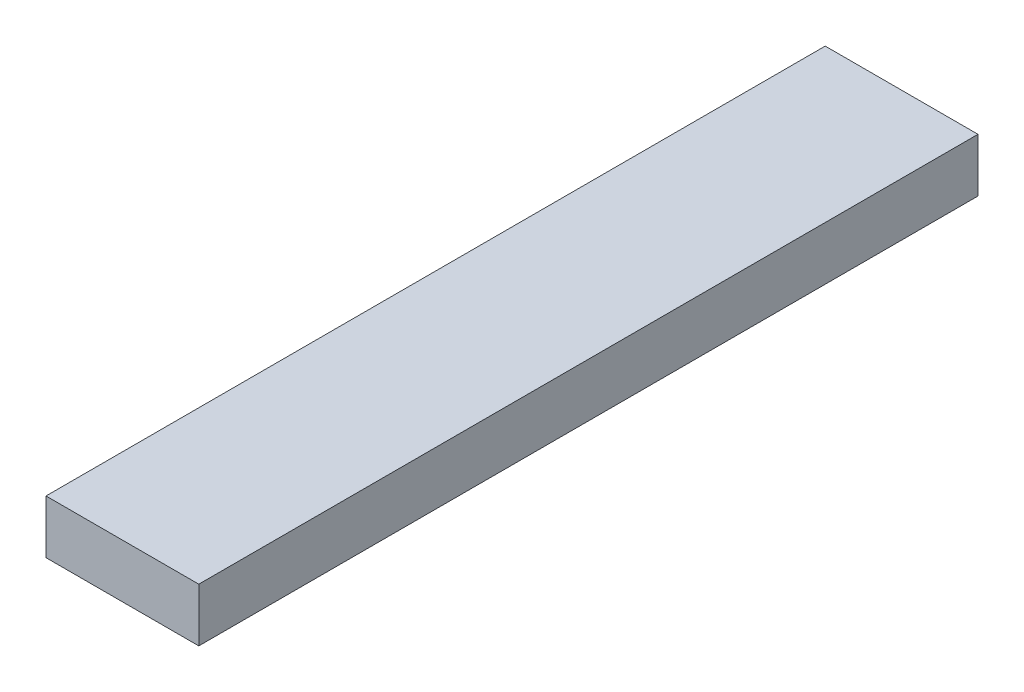
ISO-10303-21;
HEADER;
FILE_DESCRIPTION(('STEP AP214'),'2;1');
FILE_NAME('part.step','',(''),(''),'','','');
FILE_SCHEMA(('AUTOMOTIVE_DESIGN { 1 0 10303 214 1 1 1 1 }'));
ENDSEC;
DATA;
#1=APPLICATION_CONTEXT('core data for automotive mechanical design processes');
#2=APPLICATION_PROTOCOL_DEFINITION('international standard','automotive_design',2000,#1);
#3=PRODUCT_CONTEXT('',#1,'mechanical');
#4=PRODUCT('Part','Part','',(#3));
#5=PRODUCT_RELATED_PRODUCT_CATEGORY('part','',(#4));
#6=PRODUCT_DEFINITION_FORMATION('','',#4);
#7=PRODUCT_DEFINITION_CONTEXT('part definition',#1,'design');
#8=PRODUCT_DEFINITION('design','',#6,#7);
#9=PRODUCT_DEFINITION_SHAPE('','',#8);
#10=(LENGTH_UNIT() NAMED_UNIT(*) SI_UNIT(.MILLI.,.METRE.));
#11=(NAMED_UNIT(*) PLANE_ANGLE_UNIT() SI_UNIT($,.RADIAN.));
#12=(NAMED_UNIT(*) SI_UNIT($,.STERADIAN.) SOLID_ANGLE_UNIT());
#13=UNCERTAINTY_MEASURE_WITH_UNIT(LENGTH_MEASURE(1.E-05),#10,'distance_accuracy_value','');
#14=(GEOMETRIC_REPRESENTATION_CONTEXT(3) GLOBAL_UNCERTAINTY_ASSIGNED_CONTEXT((#13)) GLOBAL_UNIT_ASSIGNED_CONTEXT((#10,
#11,#12)) REPRESENTATION_CONTEXT('',''));
#15=CARTESIAN_POINT('',(0.,0.,0.));
#16=DIRECTION('',(0.,0.,1.));
#17=DIRECTION('',(1.,0.,0.));
#18=AXIS2_PLACEMENT_3D('',#15,#16,#17);
#19=CARTESIAN_POINT('',(0.,0.,-510.));
#20=DIRECTION('',(-1.,0.,0.));
#21=DIRECTION('',(0.,0.,1.));
#22=AXIS2_PLACEMENT_3D('',#19,#20,#21);
#23=PLANE('',#22);
#24=DIRECTION('',(0.,-1.,0.));
#25=VECTOR('',#24,1.);
#26=CARTESIAN_POINT('',(0.,0.,0.));
#27=LINE('',#26,#25);
#28=CARTESIAN_POINT('',(0.,35.,0.));
#29=VERTEX_POINT('',#28);
#30=CARTESIAN_POINT('',(0.,0.,0.));
#31=VERTEX_POINT('',#30);
#32=EDGE_CURVE('E98',#29,#31,#27,.T.);
#33=ORIENTED_EDGE('',*,*,#32,.F.);
#34=DIRECTION('',(0.,0.,1.));
#35=VECTOR('',#34,1.);
#36=CARTESIAN_POINT('',(0.,35.,-510.));
#37=LINE('',#36,#35);
#38=CARTESIAN_POINT('',(0.,35.,-510.));
#39=VERTEX_POINT('',#38);
#40=EDGE_CURVE('E11',#39,#29,#37,.T.);
#41=ORIENTED_EDGE('',*,*,#40,.F.);
#42=DIRECTION('',(0.,-1.,0.));
#43=VECTOR('',#42,1.);
#44=CARTESIAN_POINT('',(0.,0.,-510.));
#45=LINE('',#44,#43);
#46=CARTESIAN_POINT('',(0.,0.,-510.));
#47=VERTEX_POINT('',#46);
#48=EDGE_CURVE('E92',#39,#47,#45,.T.);
#49=ORIENTED_EDGE('',*,*,#48,.T.);
#50=DIRECTION('',(0.,0.,1.));
#51=VECTOR('',#50,1.);
#52=CARTESIAN_POINT('',(0.,0.,-510.));
#53=LINE('',#52,#51);
#54=EDGE_CURVE('E37',#47,#31,#53,.T.);
#55=ORIENTED_EDGE('',*,*,#54,.T.);
#56=EDGE_LOOP('',(#33,#41,#49,#55));
#57=FACE_BOUND('',#56,.T.);
#58=ADVANCED_FACE('F34',(#57),#23,.T.);
#59=CARTESIAN_POINT('',(0.,35.,-510.));
#60=DIRECTION('',(0.,1.,0.));
#61=DIRECTION('',(0.,0.,1.));
#62=AXIS2_PLACEMENT_3D('',#59,#60,#61);
#63=PLANE('',#62);
#64=DIRECTION('',(-1.,0.,0.));
#65=VECTOR('',#64,1.);
#66=CARTESIAN_POINT('',(0.,35.,0.));
#67=LINE('',#66,#65);
#68=CARTESIAN_POINT('',(100.,35.,0.));
#69=VERTEX_POINT('',#68);
#70=EDGE_CURVE('E94',#69,#29,#67,.T.);
#71=ORIENTED_EDGE('',*,*,#70,.F.);
#72=DIRECTION('',(0.,0.,1.));
#73=VECTOR('',#72,1.);
#74=CARTESIAN_POINT('',(100.,35.,-510.));
#75=LINE('',#74,#73);
#76=CARTESIAN_POINT('',(100.,35.,-510.));
#77=VERTEX_POINT('',#76);
#78=EDGE_CURVE('E43',#77,#69,#75,.T.);
#79=ORIENTED_EDGE('',*,*,#78,.F.);
#80=DIRECTION('',(-1.,0.,0.));
#81=VECTOR('',#80,1.);
#82=CARTESIAN_POINT('',(0.,35.,-510.));
#83=LINE('',#82,#81);
#84=EDGE_CURVE('E89',#77,#39,#83,.T.);
#85=ORIENTED_EDGE('',*,*,#84,.T.);
#86=ORIENTED_EDGE('',*,*,#40,.T.);
#87=EDGE_LOOP('',(#71,#79,#85,#86));
#88=FACE_BOUND('',#87,.T.);
#89=ADVANCED_FACE('F108',(#88),#63,.T.);
#90=CARTESIAN_POINT('',(100.,0.,-510.));
#91=DIRECTION('',(1.,0.,0.));
#92=DIRECTION('',(0.,0.,-1.));
#93=AXIS2_PLACEMENT_3D('',#90,#91,#92);
#94=PLANE('',#93);
#95=DIRECTION('',(0.,1.,0.));
#96=VECTOR('',#95,1.);
#97=CARTESIAN_POINT('',(100.,0.,0.));
#98=LINE('',#97,#96);
#99=CARTESIAN_POINT('',(100.,0.,0.));
#100=VERTEX_POINT('',#99);
#101=EDGE_CURVE('E84',#100,#69,#98,.T.);
#102=ORIENTED_EDGE('',*,*,#101,.F.);
#103=DIRECTION('',(0.,0.,1.));
#104=VECTOR('',#103,1.);
#105=CARTESIAN_POINT('',(100.,0.,-510.));
#106=LINE('',#105,#104);
#107=CARTESIAN_POINT('',(100.,0.,-510.));
#108=VERTEX_POINT('',#107);
#109=EDGE_CURVE('E79',#108,#100,#106,.T.);
#110=ORIENTED_EDGE('',*,*,#109,.F.);
#111=DIRECTION('',(0.,1.,0.));
#112=VECTOR('',#111,1.);
#113=CARTESIAN_POINT('',(100.,0.,-510.));
#114=LINE('',#113,#112);
#115=EDGE_CURVE('E82',#108,#77,#114,.T.);
#116=ORIENTED_EDGE('',*,*,#115,.T.);
#117=ORIENTED_EDGE('',*,*,#78,.T.);
#118=EDGE_LOOP('',(#102,#110,#116,#117));
#119=FACE_BOUND('',#118,.T.);
#120=ADVANCED_FACE('F81',(#119),#94,.T.);
#121=CARTESIAN_POINT('',(0.,0.,-510.));
#122=DIRECTION('',(0.,-1.,0.));
#123=DIRECTION('',(0.,0.,-1.));
#124=AXIS2_PLACEMENT_3D('',#121,#122,#123);
#125=PLANE('',#124);
#126=DIRECTION('',(1.,0.,0.));
#127=VECTOR('',#126,1.);
#128=CARTESIAN_POINT('',(0.,0.,0.));
#129=LINE('',#128,#127);
#130=EDGE_CURVE('E101',#31,#100,#129,.T.);
#131=ORIENTED_EDGE('',*,*,#130,.F.);
#132=ORIENTED_EDGE('',*,*,#54,.F.);
#133=DIRECTION('',(1.,0.,0.));
#134=VECTOR('',#133,1.);
#135=CARTESIAN_POINT('',(0.,0.,-510.));
#136=LINE('',#135,#134);
#137=EDGE_CURVE('E88',#47,#108,#136,.T.);
#138=ORIENTED_EDGE('',*,*,#137,.T.);
#139=ORIENTED_EDGE('',*,*,#109,.T.);
#140=EDGE_LOOP('',(#131,#132,#138,#139));
#141=FACE_BOUND('',#140,.T.);
#142=ADVANCED_FACE('F91',(#141),#125,.T.);
#143=CARTESIAN_POINT('',(0.,0.,-510.));
#144=DIRECTION('',(0.,0.,-1.));
#145=DIRECTION('',(-1.,0.,0.));
#146=AXIS2_PLACEMENT_3D('',#143,#144,#145);
#147=PLANE('',#146);
#148=ORIENTED_EDGE('',*,*,#48,.F.);
#149=ORIENTED_EDGE('',*,*,#84,.F.);
#150=ORIENTED_EDGE('',*,*,#115,.F.);
#151=ORIENTED_EDGE('',*,*,#137,.F.);
#152=EDGE_LOOP('',(#148,#149,#150,#151));
#153=FACE_BOUND('',#152,.T.);
#154=ADVANCED_FACE('F87',(#153),#147,.T.);
#155=CARTESIAN_POINT('',(0.,0.,0.));
#156=DIRECTION('',(0.,0.,-1.));
#157=DIRECTION('',(-1.,0.,0.));
#158=AXIS2_PLACEMENT_3D('',#155,#156,#157);
#159=PLANE('',#158);
#160=ORIENTED_EDGE('',*,*,#32,.T.);
#161=ORIENTED_EDGE('',*,*,#130,.T.);
#162=ORIENTED_EDGE('',*,*,#101,.T.);
#163=ORIENTED_EDGE('',*,*,#70,.T.);
#164=EDGE_LOOP('',(#160,#161,#162,#163));
#165=FACE_BOUND('',#164,.T.);
#166=ADVANCED_FACE('F107',(#165),#159,.F.);
#167=CLOSED_SHELL('',(#58,#89,#120,#142,#154,#166));
#168=MANIFOLD_SOLID_BREP('B2',#167);
#169=ADVANCED_BREP_SHAPE_REPRESENTATION('',(#18,#168),#14);
#170=SHAPE_DEFINITION_REPRESENTATION(#9,#169);
ENDSEC;
END-ISO-10303-21;
